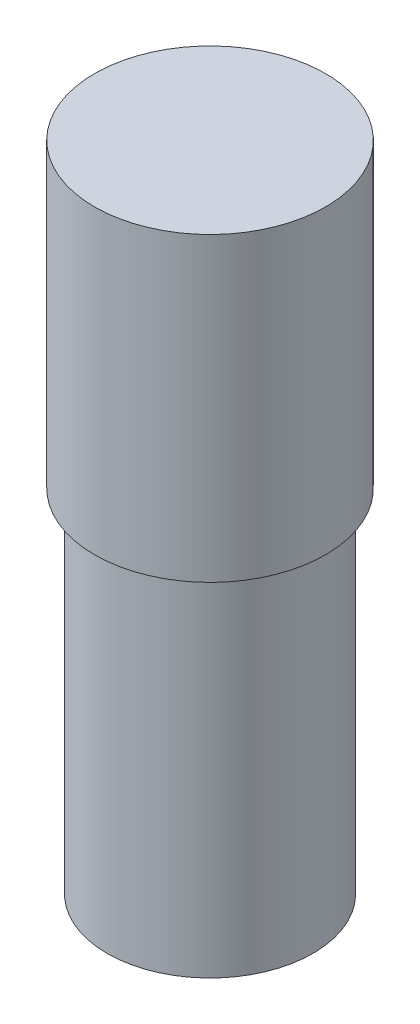
ISO-10303-21;
HEADER;
FILE_DESCRIPTION(('STEP AP214'),'2;1');
FILE_NAME('part.step','',(''),(''),'','','');
FILE_SCHEMA(('AUTOMOTIVE_DESIGN { 1 0 10303 214 1 1 1 1 }'));
ENDSEC;
DATA;
#1=APPLICATION_CONTEXT('core data for automotive mechanical design processes');
#2=APPLICATION_PROTOCOL_DEFINITION('international standard','automotive_design',2000,#1);
#3=PRODUCT_CONTEXT('',#1,'mechanical');
#4=PRODUCT('Part','Part','',(#3));
#5=PRODUCT_RELATED_PRODUCT_CATEGORY('part','',(#4));
#6=PRODUCT_DEFINITION_FORMATION('','',#4);
#7=PRODUCT_DEFINITION_CONTEXT('part definition',#1,'design');
#8=PRODUCT_DEFINITION('design','',#6,#7);
#9=PRODUCT_DEFINITION_SHAPE('','',#8);
#10=(LENGTH_UNIT() NAMED_UNIT(*) SI_UNIT(.MILLI.,.METRE.));
#11=(NAMED_UNIT(*) PLANE_ANGLE_UNIT() SI_UNIT($,.RADIAN.));
#12=(NAMED_UNIT(*) SI_UNIT($,.STERADIAN.) SOLID_ANGLE_UNIT());
#13=UNCERTAINTY_MEASURE_WITH_UNIT(LENGTH_MEASURE(1.E-05),#10,'distance_accuracy_value','');
#14=(GEOMETRIC_REPRESENTATION_CONTEXT(3) GLOBAL_UNCERTAINTY_ASSIGNED_CONTEXT((#13)) GLOBAL_UNIT_ASSIGNED_CONTEXT((#10,
#11,#12)) REPRESENTATION_CONTEXT('',''));
#15=CARTESIAN_POINT('',(0.,0.,0.));
#16=DIRECTION('',(0.,0.,1.));
#17=DIRECTION('',(1.,0.,0.));
#18=AXIS2_PLACEMENT_3D('',#15,#16,#17);
#19=CARTESIAN_POINT('',(0.,7.,0.));
#20=DIRECTION('',(0.,-1.,0.));
#21=DIRECTION('',(0.,0.,-1.));
#22=AXIS2_PLACEMENT_3D('',#19,#20,#21);
#23=CYLINDRICAL_SURFACE('',#22,2.05);
#24=CARTESIAN_POINT('',(0.,7.,0.));
#25=DIRECTION('',(0.,1.,0.));
#26=DIRECTION('',(0.,0.,1.));
#27=AXIS2_PLACEMENT_3D('',#24,#25,#26);
#28=CIRCLE('',#27,2.05);
#29=CARTESIAN_POINT('',(0.,7.,2.05));
#30=VERTEX_POINT('',#29);
#31=EDGE_CURVE('E10',#30,#30,#28,.T.);
#32=ORIENTED_EDGE('',*,*,#31,.F.);
#33=EDGE_LOOP('',(#32));
#34=FACE_BOUND('',#33,.T.);
#35=CARTESIAN_POINT('',(0.,0.,0.));
#36=DIRECTION('',(0.,1.,0.));
#37=DIRECTION('',(0.,0.,1.));
#38=AXIS2_PLACEMENT_3D('',#35,#36,#37);
#39=CIRCLE('',#38,2.05);
#40=CARTESIAN_POINT('',(0.,0.,2.05));
#41=VERTEX_POINT('',#40);
#42=EDGE_CURVE('E44',#41,#41,#39,.T.);
#43=ORIENTED_EDGE('',*,*,#42,.T.);
#44=EDGE_LOOP('',(#43));
#45=FACE_BOUND('',#44,.T.);
#46=ADVANCED_FACE('F41',(#34,#45),#23,.T.);
#47=CARTESIAN_POINT('',(0.,0.,0.));
#48=DIRECTION('',(0.,1.,0.));
#49=DIRECTION('',(0.,0.,1.));
#50=AXIS2_PLACEMENT_3D('',#47,#48,#49);
#51=PLANE('',#50);
#52=ORIENTED_EDGE('',*,*,#42,.F.);
#53=EDGE_LOOP('',(#52));
#54=FACE_BOUND('',#53,.T.);
#55=ADVANCED_FACE('F68',(#54),#51,.F.);
#56=CARTESIAN_POINT('',(0.,13.,0.));
#57=DIRECTION('',(0.,-1.,0.));
#58=DIRECTION('',(0.,0.,-1.));
#59=AXIS2_PLACEMENT_3D('',#56,#57,#58);
#60=CYLINDRICAL_SURFACE('',#59,2.3);
#61=CARTESIAN_POINT('',(0.,13.,0.));
#62=DIRECTION('',(0.,1.,0.));
#63=DIRECTION('',(0.,0.,1.));
#64=AXIS2_PLACEMENT_3D('',#61,#62,#63);
#65=CIRCLE('',#64,2.3);
#66=CARTESIAN_POINT('',(0.,13.,2.3));
#67=VERTEX_POINT('',#66);
#68=EDGE_CURVE('E53',#67,#67,#65,.T.);
#69=ORIENTED_EDGE('',*,*,#68,.F.);
#70=EDGE_LOOP('',(#69));
#71=FACE_BOUND('',#70,.T.);
#72=CARTESIAN_POINT('',(0.,7.,0.));
#73=DIRECTION('',(0.,1.,0.));
#74=DIRECTION('',(0.,0.,1.));
#75=AXIS2_PLACEMENT_3D('',#72,#73,#74);
#76=CIRCLE('',#75,2.3);
#77=CARTESIAN_POINT('',(0.,7.,2.3));
#78=VERTEX_POINT('',#77);
#79=EDGE_CURVE('E55',#78,#78,#76,.T.);
#80=ORIENTED_EDGE('',*,*,#79,.T.);
#81=EDGE_LOOP('',(#80));
#82=FACE_BOUND('',#81,.T.);
#83=ADVANCED_FACE('F65',(#71,#82),#60,.T.);
#84=CARTESIAN_POINT('',(0.,13.,0.));
#85=DIRECTION('',(0.,1.,0.));
#86=DIRECTION('',(0.,0.,1.));
#87=AXIS2_PLACEMENT_3D('',#84,#85,#86);
#88=PLANE('',#87);
#89=ORIENTED_EDGE('',*,*,#68,.T.);
#90=EDGE_LOOP('',(#89));
#91=FACE_BOUND('',#90,.T.);
#92=ADVANCED_FACE('F63',(#91),#88,.T.);
#93=CARTESIAN_POINT('',(0.,7.,0.));
#94=DIRECTION('',(0.,1.,0.));
#95=DIRECTION('',(0.,0.,1.));
#96=AXIS2_PLACEMENT_3D('',#93,#94,#95);
#97=PLANE('',#96);
#98=ORIENTED_EDGE('',*,*,#31,.T.);
#99=EDGE_LOOP('',(#98));
#100=FACE_BOUND('',#99,.T.);
#101=ORIENTED_EDGE('',*,*,#79,.F.);
#102=EDGE_LOOP('',(#101));
#103=FACE_BOUND('',#102,.T.);
#104=ADVANCED_FACE('F72',(#100,#103),#97,.F.);
#105=CLOSED_SHELL('',(#46,#55,#83,#92,#104));
#106=MANIFOLD_SOLID_BREP('B2',#105);
#107=ADVANCED_BREP_SHAPE_REPRESENTATION('',(#18,#106),#14);
#108=SHAPE_DEFINITION_REPRESENTATION(#9,#107);
ENDSEC;
END-ISO-10303-21;
